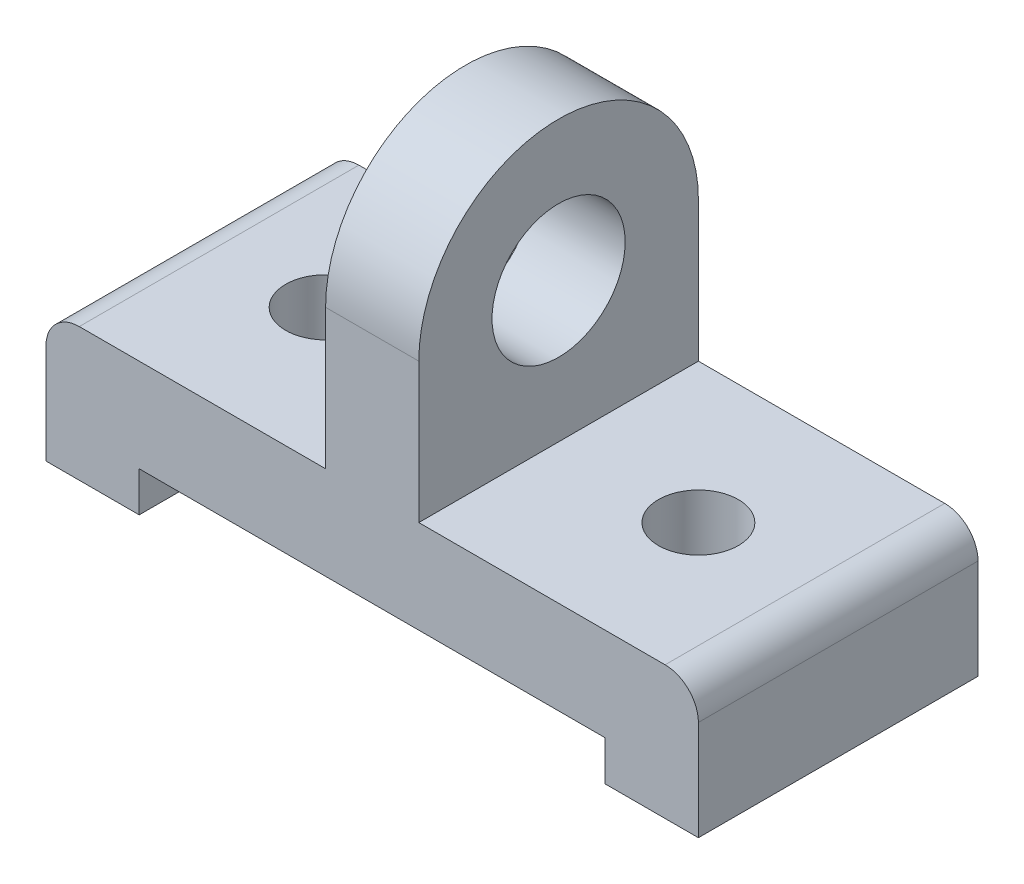
ISO-10303-21;
HEADER;
FILE_DESCRIPTION(('STEP AP214'),'2;1');
FILE_NAME('part.step','',(''),(''),'','','');
FILE_SCHEMA(('AUTOMOTIVE_DESIGN { 1 0 10303 214 1 1 1 1 }'));
ENDSEC;
DATA;
#1=APPLICATION_CONTEXT('core data for automotive mechanical design processes');
#2=APPLICATION_PROTOCOL_DEFINITION('international standard','automotive_design',2000,#1);
#3=PRODUCT_CONTEXT('',#1,'mechanical');
#4=PRODUCT('Part','Part','',(#3));
#5=PRODUCT_RELATED_PRODUCT_CATEGORY('part','',(#4));
#6=PRODUCT_DEFINITION_FORMATION('','',#4);
#7=PRODUCT_DEFINITION_CONTEXT('part definition',#1,'design');
#8=PRODUCT_DEFINITION('design','',#6,#7);
#9=PRODUCT_DEFINITION_SHAPE('','',#8);
#10=(LENGTH_UNIT() NAMED_UNIT(*) SI_UNIT(.MILLI.,.METRE.));
#11=(NAMED_UNIT(*) PLANE_ANGLE_UNIT() SI_UNIT($,.RADIAN.));
#12=(NAMED_UNIT(*) SI_UNIT($,.STERADIAN.) SOLID_ANGLE_UNIT());
#13=UNCERTAINTY_MEASURE_WITH_UNIT(LENGTH_MEASURE(1.E-05),#10,'distance_accuracy_value','');
#14=(GEOMETRIC_REPRESENTATION_CONTEXT(3) GLOBAL_UNCERTAINTY_ASSIGNED_CONTEXT((#13)) GLOBAL_UNIT_ASSIGNED_CONTEXT((#10,
#11,#12)) REPRESENTATION_CONTEXT('',''));
#15=CARTESIAN_POINT('',(0.,0.,0.));
#16=DIRECTION('',(0.,0.,1.));
#17=DIRECTION('',(1.,0.,0.));
#18=AXIS2_PLACEMENT_3D('',#15,#16,#17);
#19=CARTESIAN_POINT('',(560.,410.,-210.));
#20=DIRECTION('',(-1.,0.,0.));
#21=DIRECTION('',(0.,0.,1.));
#22=AXIS2_PLACEMENT_3D('',#19,#20,#21);
#23=CYLINDRICAL_SURFACE('',#22,210.);
#24=DIRECTION('',(1.,0.,0.));
#25=VECTOR('',#24,1.);
#26=CARTESIAN_POINT('',(560.,410.,0.));
#27=LINE('',#26,#25);
#28=CARTESIAN_POINT('',(560.,410.,0.));
#29=VERTEX_POINT('',#28);
#30=CARTESIAN_POINT('',(420.,410.,0.));
#31=VERTEX_POINT('',#30);
#32=EDGE_CURVE('E153',#29,#31,#27,.F.);
#33=ORIENTED_EDGE('',*,*,#32,.F.);
#34=CARTESIAN_POINT('',(560.,410.,-210.));
#35=DIRECTION('',(1.,0.,0.));
#36=DIRECTION('',(0.,0.,-1.));
#37=AXIS2_PLACEMENT_3D('',#34,#35,#36);
#38=CIRCLE('',#37,210.);
#39=CARTESIAN_POINT('',(560.,410.,-420.));
#40=VERTEX_POINT('',#39);
#41=EDGE_CURVE('E231',#40,#29,#38,.T.);
#42=ORIENTED_EDGE('',*,*,#41,.F.);
#43=DIRECTION('',(1.,0.,0.));
#44=VECTOR('',#43,1.);
#45=CARTESIAN_POINT('',(560.,410.,-420.));
#46=LINE('',#45,#44);
#47=CARTESIAN_POINT('',(420.,410.,-420.));
#48=VERTEX_POINT('',#47);
#49=EDGE_CURVE('E228',#48,#40,#46,.T.);
#50=ORIENTED_EDGE('',*,*,#49,.F.);
#51=CARTESIAN_POINT('',(420.,410.,-210.));
#52=DIRECTION('',(-1.,0.,0.));
#53=DIRECTION('',(0.,0.,1.));
#54=AXIS2_PLACEMENT_3D('',#51,#52,#53);
#55=CIRCLE('',#54,210.);
#56=EDGE_CURVE('E233',#31,#48,#55,.T.);
#57=ORIENTED_EDGE('',*,*,#56,.F.);
#58=EDGE_LOOP('',(#33,#42,#50,#57));
#59=FACE_BOUND('',#58,.T.);
#60=ADVANCED_FACE('F37',(#59),#23,.T.);
#61=CARTESIAN_POINT('',(0.,200.,0.));
#62=DIRECTION('',(0.,-1.,0.));
#63=DIRECTION('',(0.,0.,-1.));
#64=AXIS2_PLACEMENT_3D('',#61,#62,#63);
#65=PLANE('',#64);
#66=CARTESIAN_POINT('',(210.,200.,-210.));
#67=DIRECTION('',(0.,1.,0.));
#68=DIRECTION('',(0.,0.,-1.));
#69=AXIS2_PLACEMENT_3D('',#66,#67,#68);
#70=CIRCLE('',#69,60.0000000000001);
#71=CARTESIAN_POINT('',(210.,200.,-270.));
#72=VERTEX_POINT('',#71);
#73=EDGE_CURVE('E349',#72,#72,#70,.T.);
#74=ORIENTED_EDGE('',*,*,#73,.F.);
#75=EDGE_LOOP('',(#74));
#76=FACE_BOUND('',#75,.T.);
#77=DIRECTION('',(-1.,0.,0.));
#78=VECTOR('',#77,1.);
#79=CARTESIAN_POINT('',(0.,200.,-420.));
#80=LINE('',#79,#78);
#81=CARTESIAN_POINT('',(420.,200.,-420.));
#82=VERTEX_POINT('',#81);
#83=CARTESIAN_POINT('',(50.,200.,-420.));
#84=VERTEX_POINT('',#83);
#85=EDGE_CURVE('E144',#82,#84,#80,.T.);
#86=ORIENTED_EDGE('',*,*,#85,.T.);
#87=DIRECTION('',(0.,0.,1.));
#88=VECTOR('',#87,1.);
#89=CARTESIAN_POINT('',(50.,200.,0.));
#90=LINE('',#89,#88);
#91=CARTESIAN_POINT('',(50.,200.,0.));
#92=VERTEX_POINT('',#91);
#93=EDGE_CURVE('E143',#84,#92,#90,.T.);
#94=ORIENTED_EDGE('',*,*,#93,.T.);
#95=DIRECTION('',(1.,0.,0.));
#96=VECTOR('',#95,1.);
#97=CARTESIAN_POINT('',(980.,200.,0.));
#98=LINE('',#97,#96);
#99=CARTESIAN_POINT('',(420.,200.,0.));
#100=VERTEX_POINT('',#99);
#101=EDGE_CURVE('E135',#92,#100,#98,.T.);
#102=ORIENTED_EDGE('',*,*,#101,.T.);
#103=DIRECTION('',(0.,0.,1.));
#104=VECTOR('',#103,1.);
#105=CARTESIAN_POINT('',(420.,200.,-862.718872423573));
#106=LINE('',#105,#104);
#107=EDGE_CURVE('E140',#82,#100,#106,.T.);
#108=ORIENTED_EDGE('',*,*,#107,.F.);
#109=EDGE_LOOP('',(#86,#94,#102,#108));
#110=FACE_BOUND('',#109,.T.);
#111=ADVANCED_FACE('F138',(#76,#110),#65,.F.);
#112=CARTESIAN_POINT('',(980.,200.,0.));
#113=DIRECTION('',(0.,0.,-1.));
#114=DIRECTION('',(-1.,0.,0.));
#115=AXIS2_PLACEMENT_3D('',#112,#113,#114);
#116=PLANE('',#115);
#117=ORIENTED_EDGE('',*,*,#101,.F.);
#118=CARTESIAN_POINT('',(50.,150.,0.));
#119=DIRECTION('',(0.,0.,-1.));
#120=DIRECTION('',(-1.,0.,0.));
#121=AXIS2_PLACEMENT_3D('',#118,#119,#120);
#122=CIRCLE('',#121,50.);
#123=CARTESIAN_POINT('',(0.,150.,0.));
#124=VERTEX_POINT('',#123);
#125=EDGE_CURVE('E59',#92,#124,#122,.F.);
#126=ORIENTED_EDGE('',*,*,#125,.T.);
#127=DIRECTION('',(0.,-1.,0.));
#128=VECTOR('',#127,1.);
#129=CARTESIAN_POINT('',(0.,200.,0.));
#130=LINE('',#129,#128);
#131=CARTESIAN_POINT('',(0.,0.,0.));
#132=VERTEX_POINT('',#131);
#133=EDGE_CURVE('E198',#124,#132,#130,.T.);
#134=ORIENTED_EDGE('',*,*,#133,.T.);
#135=DIRECTION('',(1.,0.,0.));
#136=VECTOR('',#135,1.);
#137=CARTESIAN_POINT('',(980.,0.,0.));
#138=LINE('',#137,#136);
#139=CARTESIAN_POINT('',(140.,0.,0.));
#140=VERTEX_POINT('',#139);
#141=EDGE_CURVE('E199',#132,#140,#138,.T.);
#142=ORIENTED_EDGE('',*,*,#141,.T.);
#143=DIRECTION('',(0.,1.,0.));
#144=VECTOR('',#143,1.);
#145=CARTESIAN_POINT('',(140.,0.,0.));
#146=LINE('',#145,#144);
#147=CARTESIAN_POINT('',(140.,60.,0.));
#148=VERTEX_POINT('',#147);
#149=EDGE_CURVE('E176',#140,#148,#146,.T.);
#150=ORIENTED_EDGE('',*,*,#149,.T.);
#151=DIRECTION('',(1.,0.,0.));
#152=VECTOR('',#151,1.);
#153=CARTESIAN_POINT('',(140.,60.,0.));
#154=LINE('',#153,#152);
#155=CARTESIAN_POINT('',(840.,60.,0.));
#156=VERTEX_POINT('',#155);
#157=EDGE_CURVE('E179',#148,#156,#154,.T.);
#158=ORIENTED_EDGE('',*,*,#157,.T.);
#159=DIRECTION('',(0.,-1.,0.));
#160=VECTOR('',#159,1.);
#161=CARTESIAN_POINT('',(840.,60.,0.));
#162=LINE('',#161,#160);
#163=CARTESIAN_POINT('',(840.,0.,0.));
#164=VERTEX_POINT('',#163);
#165=EDGE_CURVE('E182',#156,#164,#162,.T.);
#166=ORIENTED_EDGE('',*,*,#165,.T.);
#167=CARTESIAN_POINT('',(980.,0.,0.));
#168=VERTEX_POINT('',#167);
#169=EDGE_CURVE('E175',#164,#168,#138,.T.);
#170=ORIENTED_EDGE('',*,*,#169,.T.);
#171=DIRECTION('',(0.,-1.,0.));
#172=VECTOR('',#171,1.);
#173=CARTESIAN_POINT('',(980.,200.,0.));
#174=LINE('',#173,#172);
#175=CARTESIAN_POINT('',(980.,150.,0.));
#176=VERTEX_POINT('',#175);
#177=EDGE_CURVE('E217',#176,#168,#174,.T.);
#178=ORIENTED_EDGE('',*,*,#177,.F.);
#179=CARTESIAN_POINT('',(930.,150.,0.));
#180=DIRECTION('',(0.,0.,-1.));
#181=DIRECTION('',(-1.,0.,0.));
#182=AXIS2_PLACEMENT_3D('',#179,#180,#181);
#183=CIRCLE('',#182,50.);
#184=CARTESIAN_POINT('',(930.,200.,0.));
#185=VERTEX_POINT('',#184);
#186=EDGE_CURVE('E242',#176,#185,#183,.F.);
#187=ORIENTED_EDGE('',*,*,#186,.T.);
#188=CARTESIAN_POINT('',(560.,200.,0.));
#189=VERTEX_POINT('',#188);
#190=EDGE_CURVE('E145',#189,#185,#98,.T.);
#191=ORIENTED_EDGE('',*,*,#190,.F.);
#192=DIRECTION('',(0.,1.,0.));
#193=VECTOR('',#192,1.);
#194=CARTESIAN_POINT('',(560.,620.,0.));
#195=LINE('',#194,#193);
#196=EDGE_CURVE('E155',#189,#29,#195,.T.);
#197=ORIENTED_EDGE('',*,*,#196,.T.);
#198=ORIENTED_EDGE('',*,*,#32,.T.);
#199=DIRECTION('',(0.,-1.,0.));
#200=VECTOR('',#199,1.);
#201=CARTESIAN_POINT('',(420.,200.,0.));
#202=LINE('',#201,#200);
#203=EDGE_CURVE('E149',#31,#100,#202,.T.);
#204=ORIENTED_EDGE('',*,*,#203,.T.);
#205=EDGE_LOOP('',(#117,#126,#134,#142,#150,#158,#166,#170,#178,#187,#191,#197,#198,#204));
#206=FACE_BOUND('',#205,.T.);
#207=ADVANCED_FACE('F150',(#206),#116,.F.);
#208=CARTESIAN_POINT('',(0.,200.,-420.));
#209=DIRECTION('',(0.,0.,1.));
#210=DIRECTION('',(1.,0.,0.));
#211=AXIS2_PLACEMENT_3D('',#208,#209,#210);
#212=PLANE('',#211);
#213=DIRECTION('',(0.,-1.,0.));
#214=VECTOR('',#213,1.);
#215=CARTESIAN_POINT('',(0.,200.,-420.));
#216=LINE('',#215,#214);
#217=CARTESIAN_POINT('',(0.,150.,-420.));
#218=VERTEX_POINT('',#217);
#219=CARTESIAN_POINT('',(0.,0.,-420.));
#220=VERTEX_POINT('',#219);
#221=EDGE_CURVE('E213',#218,#220,#216,.T.);
#222=ORIENTED_EDGE('',*,*,#221,.F.);
#223=CARTESIAN_POINT('',(50.,150.,-420.));
#224=DIRECTION('',(0.,0.,1.));
#225=DIRECTION('',(1.,0.,0.));
#226=AXIS2_PLACEMENT_3D('',#223,#224,#225);
#227=CIRCLE('',#226,50.);
#228=EDGE_CURVE('E11',#218,#84,#227,.F.);
#229=ORIENTED_EDGE('',*,*,#228,.T.);
#230=ORIENTED_EDGE('',*,*,#85,.F.);
#231=DIRECTION('',(0.,1.,0.));
#232=VECTOR('',#231,1.);
#233=CARTESIAN_POINT('',(420.,200.,-420.));
#234=LINE('',#233,#232);
#235=EDGE_CURVE('E161',#82,#48,#234,.T.);
#236=ORIENTED_EDGE('',*,*,#235,.T.);
#237=ORIENTED_EDGE('',*,*,#49,.T.);
#238=DIRECTION('',(0.,-1.,0.));
#239=VECTOR('',#238,1.);
#240=CARTESIAN_POINT('',(560.,620.,-420.));
#241=LINE('',#240,#239);
#242=CARTESIAN_POINT('',(560.,200.,-420.));
#243=VERTEX_POINT('',#242);
#244=EDGE_CURVE('E164',#40,#243,#241,.T.);
#245=ORIENTED_EDGE('',*,*,#244,.T.);
#246=CARTESIAN_POINT('',(930.,200.,-420.));
#247=VERTEX_POINT('',#246);
#248=EDGE_CURVE('E196',#247,#243,#80,.T.);
#249=ORIENTED_EDGE('',*,*,#248,.F.);
#250=CARTESIAN_POINT('',(930.,150.,-420.));
#251=DIRECTION('',(0.,0.,1.));
#252=DIRECTION('',(1.,0.,0.));
#253=AXIS2_PLACEMENT_3D('',#250,#251,#252);
#254=CIRCLE('',#253,50.);
#255=CARTESIAN_POINT('',(980.,150.,-420.));
#256=VERTEX_POINT('',#255);
#257=EDGE_CURVE('E238',#247,#256,#254,.F.);
#258=ORIENTED_EDGE('',*,*,#257,.T.);
#259=DIRECTION('',(0.,-1.,0.));
#260=VECTOR('',#259,1.);
#261=CARTESIAN_POINT('',(980.,200.,-420.));
#262=LINE('',#261,#260);
#263=CARTESIAN_POINT('',(980.,0.,-420.));
#264=VERTEX_POINT('',#263);
#265=EDGE_CURVE('E215',#256,#264,#262,.T.);
#266=ORIENTED_EDGE('',*,*,#265,.T.);
#267=DIRECTION('',(-1.,0.,0.));
#268=VECTOR('',#267,1.);
#269=CARTESIAN_POINT('',(0.,0.,-420.));
#270=LINE('',#269,#268);
#271=CARTESIAN_POINT('',(840.,0.,-420.));
#272=VERTEX_POINT('',#271);
#273=EDGE_CURVE('E206',#264,#272,#270,.T.);
#274=ORIENTED_EDGE('',*,*,#273,.T.);
#275=DIRECTION('',(0.,1.,0.));
#276=VECTOR('',#275,1.);
#277=CARTESIAN_POINT('',(840.,60.,-420.));
#278=LINE('',#277,#276);
#279=CARTESIAN_POINT('',(840.,60.,-420.));
#280=VERTEX_POINT('',#279);
#281=EDGE_CURVE('E172',#272,#280,#278,.T.);
#282=ORIENTED_EDGE('',*,*,#281,.T.);
#283=DIRECTION('',(-1.,0.,0.));
#284=VECTOR('',#283,1.);
#285=CARTESIAN_POINT('',(140.,60.,-420.));
#286=LINE('',#285,#284);
#287=CARTESIAN_POINT('',(140.,60.,-420.));
#288=VERTEX_POINT('',#287);
#289=EDGE_CURVE('E168',#280,#288,#286,.T.);
#290=ORIENTED_EDGE('',*,*,#289,.T.);
#291=DIRECTION('',(0.,-1.,0.));
#292=VECTOR('',#291,1.);
#293=CARTESIAN_POINT('',(140.,0.,-420.));
#294=LINE('',#293,#292);
#295=CARTESIAN_POINT('',(140.,0.,-420.));
#296=VERTEX_POINT('',#295);
#297=EDGE_CURVE('E171',#288,#296,#294,.T.);
#298=ORIENTED_EDGE('',*,*,#297,.T.);
#299=EDGE_CURVE('E205',#296,#220,#270,.T.);
#300=ORIENTED_EDGE('',*,*,#299,.T.);
#301=EDGE_LOOP('',(#222,#229,#230,#236,#237,#245,#249,#258,#266,#274,#282,#290,#298,#300));
#302=FACE_BOUND('',#301,.T.);
#303=ADVANCED_FACE('F261',(#302),#212,.F.);
#304=CARTESIAN_POINT('',(0.,0.,0.));
#305=DIRECTION('',(0.,-1.,0.));
#306=DIRECTION('',(0.,0.,-1.));
#307=AXIS2_PLACEMENT_3D('',#304,#305,#306);
#308=PLANE('',#307);
#309=ORIENTED_EDGE('',*,*,#169,.F.);
#310=DIRECTION('',(0.,0.,1.));
#311=VECTOR('',#310,1.);
#312=CARTESIAN_POINT('',(840.,0.,-1122.56672281001));
#313=LINE('',#312,#311);
#314=EDGE_CURVE('E185',#272,#164,#313,.T.);
#315=ORIENTED_EDGE('',*,*,#314,.F.);
#316=ORIENTED_EDGE('',*,*,#273,.F.);
#317=DIRECTION('',(0.,0.,-1.));
#318=VECTOR('',#317,1.);
#319=CARTESIAN_POINT('',(980.,0.,-420.));
#320=LINE('',#319,#318);
#321=EDGE_CURVE('E202',#168,#264,#320,.T.);
#322=ORIENTED_EDGE('',*,*,#321,.F.);
#323=EDGE_LOOP('',(#309,#315,#316,#322));
#324=FACE_BOUND('',#323,.T.);
#325=ADVANCED_FACE('F270',(#324),#308,.T.);
#326=ORIENTED_EDGE('',*,*,#299,.F.);
#327=DIRECTION('',(0.,0.,1.));
#328=VECTOR('',#327,1.);
#329=CARTESIAN_POINT('',(140.,0.,-1122.56672281001));
#330=LINE('',#329,#328);
#331=EDGE_CURVE('E191',#296,#140,#330,.T.);
#332=ORIENTED_EDGE('',*,*,#331,.T.);
#333=ORIENTED_EDGE('',*,*,#141,.F.);
#334=DIRECTION('',(0.,0.,1.));
#335=VECTOR('',#334,1.);
#336=CARTESIAN_POINT('',(0.,0.,0.));
#337=LINE('',#336,#335);
#338=EDGE_CURVE('E209',#220,#132,#337,.T.);
#339=ORIENTED_EDGE('',*,*,#338,.F.);
#340=EDGE_LOOP('',(#326,#332,#333,#339));
#341=FACE_BOUND('',#340,.T.);
#342=ADVANCED_FACE('F285',(#341),#308,.T.);
#343=CARTESIAN_POINT('',(980.,200.,-420.));
#344=DIRECTION('',(-1.,0.,0.));
#345=DIRECTION('',(0.,0.,1.));
#346=AXIS2_PLACEMENT_3D('',#343,#344,#345);
#347=PLANE('',#346);
#348=ORIENTED_EDGE('',*,*,#265,.F.);
#349=DIRECTION('',(0.,0.,-1.));
#350=VECTOR('',#349,1.);
#351=CARTESIAN_POINT('',(980.,150.,-420.));
#352=LINE('',#351,#350);
#353=EDGE_CURVE('E240',#256,#176,#352,.F.);
#354=ORIENTED_EDGE('',*,*,#353,.T.);
#355=ORIENTED_EDGE('',*,*,#177,.T.);
#356=ORIENTED_EDGE('',*,*,#321,.T.);
#357=EDGE_LOOP('',(#348,#354,#355,#356));
#358=FACE_BOUND('',#357,.T.);
#359=ADVANCED_FACE('F264',(#358),#347,.F.);
#360=CARTESIAN_POINT('',(0.,200.,0.));
#361=DIRECTION('',(1.,0.,0.));
#362=DIRECTION('',(0.,0.,-1.));
#363=AXIS2_PLACEMENT_3D('',#360,#361,#362);
#364=PLANE('',#363);
#365=ORIENTED_EDGE('',*,*,#133,.F.);
#366=DIRECTION('',(0.,0.,1.));
#367=VECTOR('',#366,1.);
#368=CARTESIAN_POINT('',(0.,150.,0.));
#369=LINE('',#368,#367);
#370=EDGE_CURVE('E45',#124,#218,#369,.F.);
#371=ORIENTED_EDGE('',*,*,#370,.T.);
#372=ORIENTED_EDGE('',*,*,#221,.T.);
#373=ORIENTED_EDGE('',*,*,#338,.T.);
#374=EDGE_LOOP('',(#365,#371,#372,#373));
#375=FACE_BOUND('',#374,.T.);
#376=ADVANCED_FACE('F287',(#375),#364,.F.);
#377=CARTESIAN_POINT('',(770.,200.,-210.));
#378=DIRECTION('',(0.,1.,0.));
#379=DIRECTION('',(0.,0.,1.));
#380=AXIS2_PLACEMENT_3D('',#377,#378,#379);
#381=CIRCLE('',#380,60.0000000000001);
#382=CARTESIAN_POINT('',(770.,200.,-150.));
#383=VERTEX_POINT('',#382);
#384=EDGE_CURVE('E223',#383,#383,#381,.T.);
#385=ORIENTED_EDGE('',*,*,#384,.F.);
#386=EDGE_LOOP('',(#385));
#387=FACE_BOUND('',#386,.T.);
#388=ORIENTED_EDGE('',*,*,#190,.T.);
#389=DIRECTION('',(0.,0.,-1.));
#390=VECTOR('',#389,1.);
#391=CARTESIAN_POINT('',(930.,200.,0.));
#392=LINE('',#391,#390);
#393=EDGE_CURVE('E235',#185,#247,#392,.T.);
#394=ORIENTED_EDGE('',*,*,#393,.T.);
#395=ORIENTED_EDGE('',*,*,#248,.T.);
#396=DIRECTION('',(0.,0.,1.));
#397=VECTOR('',#396,1.);
#398=CARTESIAN_POINT('',(560.,200.,-862.718872423573));
#399=LINE('',#398,#397);
#400=EDGE_CURVE('E162',#243,#189,#399,.T.);
#401=ORIENTED_EDGE('',*,*,#400,.T.);
#402=EDGE_LOOP('',(#388,#394,#395,#401));
#403=FACE_BOUND('',#402,.T.);
#404=ADVANCED_FACE('F255',(#387,#403),#65,.F.);
#405=CARTESIAN_POINT('',(840.,60.,-1122.56672281001));
#406=DIRECTION('',(-1.,0.,0.));
#407=DIRECTION('',(0.,0.,1.));
#408=AXIS2_PLACEMENT_3D('',#405,#406,#407);
#409=PLANE('',#408);
#410=ORIENTED_EDGE('',*,*,#314,.T.);
#411=ORIENTED_EDGE('',*,*,#165,.F.);
#412=DIRECTION('',(0.,0.,1.));
#413=VECTOR('',#412,1.);
#414=CARTESIAN_POINT('',(840.,60.,-1122.56672281001));
#415=LINE('',#414,#413);
#416=EDGE_CURVE('E187',#280,#156,#415,.T.);
#417=ORIENTED_EDGE('',*,*,#416,.F.);
#418=ORIENTED_EDGE('',*,*,#281,.F.);
#419=EDGE_LOOP('',(#410,#411,#417,#418));
#420=FACE_BOUND('',#419,.T.);
#421=ADVANCED_FACE('F273',(#420),#409,.T.);
#422=CARTESIAN_POINT('',(140.,60.,-1122.56672281001));
#423=DIRECTION('',(0.,-1.,0.));
#424=DIRECTION('',(0.,0.,-1.));
#425=AXIS2_PLACEMENT_3D('',#422,#423,#424);
#426=PLANE('',#425);
#427=CARTESIAN_POINT('',(770.,60.,-210.));
#428=DIRECTION('',(0.,-1.,0.));
#429=DIRECTION('',(0.,0.,-1.));
#430=AXIS2_PLACEMENT_3D('',#427,#428,#429);
#431=CIRCLE('',#430,60.0000000000001);
#432=CARTESIAN_POINT('',(770.,60.,-270.));
#433=VERTEX_POINT('',#432);
#434=EDGE_CURVE('E222',#433,#433,#431,.T.);
#435=ORIENTED_EDGE('',*,*,#434,.F.);
#436=EDGE_LOOP('',(#435));
#437=FACE_BOUND('',#436,.T.);
#438=CARTESIAN_POINT('',(210.,60.,-210.));
#439=DIRECTION('',(0.,-1.,0.));
#440=DIRECTION('',(0.,0.,-1.));
#441=AXIS2_PLACEMENT_3D('',#438,#439,#440);
#442=CIRCLE('',#441,60.0000000000001);
#443=CARTESIAN_POINT('',(210.,60.,-270.));
#444=VERTEX_POINT('',#443);
#445=EDGE_CURVE('E219',#444,#444,#442,.T.);
#446=ORIENTED_EDGE('',*,*,#445,.F.);
#447=EDGE_LOOP('',(#446));
#448=FACE_BOUND('',#447,.T.);
#449=ORIENTED_EDGE('',*,*,#416,.T.);
#450=ORIENTED_EDGE('',*,*,#157,.F.);
#451=DIRECTION('',(0.,0.,1.));
#452=VECTOR('',#451,1.);
#453=CARTESIAN_POINT('',(140.,60.,-1122.56672281001));
#454=LINE('',#453,#452);
#455=EDGE_CURVE('E189',#288,#148,#454,.T.);
#456=ORIENTED_EDGE('',*,*,#455,.F.);
#457=ORIENTED_EDGE('',*,*,#289,.F.);
#458=EDGE_LOOP('',(#449,#450,#456,#457));
#459=FACE_BOUND('',#458,.T.);
#460=ADVANCED_FACE('F277',(#437,#448,#459),#426,.T.);
#461=CARTESIAN_POINT('',(140.,0.,-1122.56672281001));
#462=DIRECTION('',(1.,0.,0.));
#463=DIRECTION('',(0.,0.,-1.));
#464=AXIS2_PLACEMENT_3D('',#461,#462,#463);
#465=PLANE('',#464);
#466=ORIENTED_EDGE('',*,*,#455,.T.);
#467=ORIENTED_EDGE('',*,*,#149,.F.);
#468=ORIENTED_EDGE('',*,*,#331,.F.);
#469=ORIENTED_EDGE('',*,*,#297,.F.);
#470=EDGE_LOOP('',(#466,#467,#468,#469));
#471=FACE_BOUND('',#470,.T.);
#472=ADVANCED_FACE('F280',(#471),#465,.T.);
#473=CARTESIAN_POINT('',(420.,200.,-862.718872423573));
#474=DIRECTION('',(-1.,0.,0.));
#475=DIRECTION('',(0.,0.,1.));
#476=AXIS2_PLACEMENT_3D('',#473,#474,#475);
#477=PLANE('',#476);
#478=CARTESIAN_POINT('',(420.,410.,-210.));
#479=DIRECTION('',(-1.,0.,0.));
#480=DIRECTION('',(0.,0.,1.));
#481=AXIS2_PLACEMENT_3D('',#478,#479,#480);
#482=CIRCLE('',#481,100.);
#483=CARTESIAN_POINT('',(420.,410.,-110.));
#484=VERTEX_POINT('',#483);
#485=EDGE_CURVE('E156',#484,#484,#482,.T.);
#486=ORIENTED_EDGE('',*,*,#485,.F.);
#487=EDGE_LOOP('',(#486));
#488=FACE_BOUND('',#487,.T.);
#489=ORIENTED_EDGE('',*,*,#203,.F.);
#490=ORIENTED_EDGE('',*,*,#56,.T.);
#491=ORIENTED_EDGE('',*,*,#235,.F.);
#492=ORIENTED_EDGE('',*,*,#107,.T.);
#493=EDGE_LOOP('',(#489,#490,#491,#492));
#494=FACE_BOUND('',#493,.T.);
#495=ADVANCED_FACE('F159',(#488,#494),#477,.T.);
#496=CARTESIAN_POINT('',(560.,620.,-862.718872423573));
#497=DIRECTION('',(1.,0.,0.));
#498=DIRECTION('',(0.,0.,-1.));
#499=AXIS2_PLACEMENT_3D('',#496,#497,#498);
#500=PLANE('',#499);
#501=CARTESIAN_POINT('',(560.,410.,-210.));
#502=DIRECTION('',(1.,0.,0.));
#503=DIRECTION('',(0.,0.,-1.));
#504=AXIS2_PLACEMENT_3D('',#501,#502,#503);
#505=CIRCLE('',#504,100.);
#506=CARTESIAN_POINT('',(560.,410.,-310.));
#507=VERTEX_POINT('',#506);
#508=EDGE_CURVE('E226',#507,#507,#505,.T.);
#509=ORIENTED_EDGE('',*,*,#508,.F.);
#510=EDGE_LOOP('',(#509));
#511=FACE_BOUND('',#510,.T.);
#512=ORIENTED_EDGE('',*,*,#244,.F.);
#513=ORIENTED_EDGE('',*,*,#41,.T.);
#514=ORIENTED_EDGE('',*,*,#196,.F.);
#515=ORIENTED_EDGE('',*,*,#400,.F.);
#516=EDGE_LOOP('',(#512,#513,#514,#515));
#517=FACE_BOUND('',#516,.T.);
#518=ADVANCED_FACE('F328',(#511,#517),#500,.T.);
#519=CARTESIAN_POINT('',(360.,410.,-210.));
#520=DIRECTION('',(1.,0.,0.));
#521=DIRECTION('',(0.,0.,-1.));
#522=AXIS2_PLACEMENT_3D('',#519,#520,#521);
#523=CYLINDRICAL_SURFACE('',#522,100.);
#524=ORIENTED_EDGE('',*,*,#485,.T.);
#525=EDGE_LOOP('',(#524));
#526=FACE_BOUND('',#525,.T.);
#527=ORIENTED_EDGE('',*,*,#508,.T.);
#528=EDGE_LOOP('',(#527));
#529=FACE_BOUND('',#528,.T.);
#530=ADVANCED_FACE('F332',(#526,#529),#523,.F.);
#531=CARTESIAN_POINT('',(210.,0.,-210.));
#532=DIRECTION('',(0.,1.,0.));
#533=DIRECTION('',(0.,0.,1.));
#534=AXIS2_PLACEMENT_3D('',#531,#532,#533);
#535=CYLINDRICAL_SURFACE('',#534,60.0000000000001);
#536=ORIENTED_EDGE('',*,*,#445,.T.);
#537=EDGE_LOOP('',(#536));
#538=FACE_BOUND('',#537,.T.);
#539=ORIENTED_EDGE('',*,*,#73,.T.);
#540=EDGE_LOOP('',(#539));
#541=FACE_BOUND('',#540,.T.);
#542=ADVANCED_FACE('F336',(#538,#541),#535,.F.);
#543=CARTESIAN_POINT('',(770.,0.,-210.));
#544=DIRECTION('',(0.,1.,0.));
#545=DIRECTION('',(0.,0.,1.));
#546=AXIS2_PLACEMENT_3D('',#543,#544,#545);
#547=CYLINDRICAL_SURFACE('',#546,60.0000000000001);
#548=ORIENTED_EDGE('',*,*,#434,.T.);
#549=EDGE_LOOP('',(#548));
#550=FACE_BOUND('',#549,.T.);
#551=ORIENTED_EDGE('',*,*,#384,.T.);
#552=EDGE_LOOP('',(#551));
#553=FACE_BOUND('',#552,.T.);
#554=ADVANCED_FACE('F294',(#550,#553),#547,.F.);
#555=CARTESIAN_POINT('',(930.,150.,0.));
#556=DIRECTION('',(0.,0.,-1.));
#557=DIRECTION('',(-1.,0.,0.));
#558=AXIS2_PLACEMENT_3D('',#555,#556,#557);
#559=CYLINDRICAL_SURFACE('',#558,50.);
#560=ORIENTED_EDGE('',*,*,#186,.F.);
#561=ORIENTED_EDGE('',*,*,#353,.F.);
#562=ORIENTED_EDGE('',*,*,#257,.F.);
#563=ORIENTED_EDGE('',*,*,#393,.F.);
#564=EDGE_LOOP('',(#560,#561,#562,#563));
#565=FACE_BOUND('',#564,.T.);
#566=ADVANCED_FACE('F258',(#565),#559,.T.);
#567=CARTESIAN_POINT('',(50.,150.,0.));
#568=DIRECTION('',(0.,0.,1.));
#569=DIRECTION('',(1.,0.,0.));
#570=AXIS2_PLACEMENT_3D('',#567,#568,#569);
#571=CYLINDRICAL_SURFACE('',#570,50.);
#572=ORIENTED_EDGE('',*,*,#228,.F.);
#573=ORIENTED_EDGE('',*,*,#370,.F.);
#574=ORIENTED_EDGE('',*,*,#125,.F.);
#575=ORIENTED_EDGE('',*,*,#93,.F.);
#576=EDGE_LOOP('',(#572,#573,#574,#575));
#577=FACE_BOUND('',#576,.T.);
#578=ADVANCED_FACE('F39',(#577),#571,.T.);
#579=CLOSED_SHELL('',(#60,#111,#207,#303,#325,#342,#359,#376,#404,#421,#460,#472,#495,#518,#530,
#542,#554,#566,#578));
#580=MANIFOLD_SOLID_BREP('B2',#579);
#581=ADVANCED_BREP_SHAPE_REPRESENTATION('',(#18,#580),#14);
#582=SHAPE_DEFINITION_REPRESENTATION(#9,#581);
ENDSEC;
END-ISO-10303-21;
